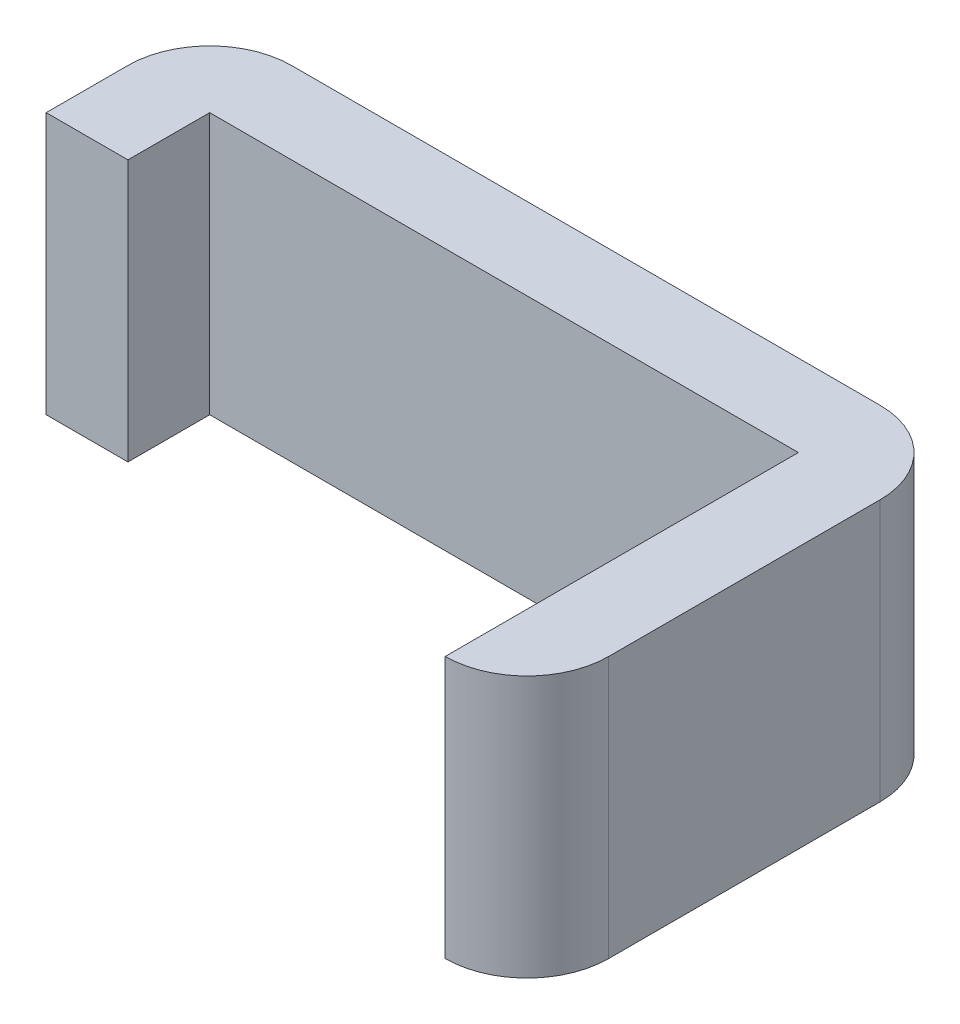
ISO-10303-21;
HEADER;
FILE_DESCRIPTION(('STEP AP214'),'2;1');
FILE_NAME('part.step','',(''),(''),'','','');
FILE_SCHEMA(('AUTOMOTIVE_DESIGN { 1 0 10303 214 1 1 1 1 }'));
ENDSEC;
DATA;
#1=APPLICATION_CONTEXT('core data for automotive mechanical design processes');
#2=APPLICATION_PROTOCOL_DEFINITION('international standard','automotive_design',2000,#1);
#3=PRODUCT_CONTEXT('',#1,'mechanical');
#4=PRODUCT('Part','Part','',(#3));
#5=PRODUCT_RELATED_PRODUCT_CATEGORY('part','',(#4));
#6=PRODUCT_DEFINITION_FORMATION('','',#4);
#7=PRODUCT_DEFINITION_CONTEXT('part definition',#1,'design');
#8=PRODUCT_DEFINITION('design','',#6,#7);
#9=PRODUCT_DEFINITION_SHAPE('','',#8);
#10=(LENGTH_UNIT() NAMED_UNIT(*) SI_UNIT(.MILLI.,.METRE.));
#11=(NAMED_UNIT(*) PLANE_ANGLE_UNIT() SI_UNIT($,.RADIAN.));
#12=(NAMED_UNIT(*) SI_UNIT($,.STERADIAN.) SOLID_ANGLE_UNIT());
#13=UNCERTAINTY_MEASURE_WITH_UNIT(LENGTH_MEASURE(1.E-05),#10,'distance_accuracy_value','');
#14=(GEOMETRIC_REPRESENTATION_CONTEXT(3) GLOBAL_UNCERTAINTY_ASSIGNED_CONTEXT((#13)) GLOBAL_UNIT_ASSIGNED_CONTEXT((#10,
#11,#12)) REPRESENTATION_CONTEXT('',''));
#15=CARTESIAN_POINT('',(0.,0.,0.));
#16=DIRECTION('',(0.,0.,1.));
#17=DIRECTION('',(1.,0.,0.));
#18=AXIS2_PLACEMENT_3D('',#15,#16,#17);
#19=CARTESIAN_POINT('',(-2.1,-0.4,0.25));
#20=DIRECTION('',(0.,0.,-1.));
#21=DIRECTION('',(-1.,0.,0.));
#22=AXIS2_PLACEMENT_3D('',#19,#20,#21);
#23=PLANE('',#22);
#24=DIRECTION('',(0.,1.,0.));
#25=VECTOR('',#24,1.);
#26=CARTESIAN_POINT('',(-0.3,-0.4,0.25));
#27=LINE('',#26,#25);
#28=CARTESIAN_POINT('',(-0.3,-0.4,0.25));
#29=VERTEX_POINT('',#28);
#30=CARTESIAN_POINT('',(-0.3,0.4,0.25));
#31=VERTEX_POINT('',#30);
#32=EDGE_CURVE('E125',#29,#31,#27,.T.);
#33=ORIENTED_EDGE('',*,*,#32,.T.);
#34=DIRECTION('',(1.,0.,0.));
#35=VECTOR('',#34,1.);
#36=CARTESIAN_POINT('',(-0.3,0.4,0.25));
#37=LINE('',#36,#35);
#38=CARTESIAN_POINT('',(-2.1,0.4,0.25));
#39=VERTEX_POINT('',#38);
#40=EDGE_CURVE('E112',#31,#39,#37,.F.);
#41=ORIENTED_EDGE('',*,*,#40,.T.);
#42=DIRECTION('',(0.,1.,0.));
#43=VECTOR('',#42,1.);
#44=CARTESIAN_POINT('',(-2.1,-0.4,0.25));
#45=LINE('',#44,#43);
#46=CARTESIAN_POINT('',(-2.1,-0.4,0.25));
#47=VERTEX_POINT('',#46);
#48=EDGE_CURVE('E108',#39,#47,#45,.F.);
#49=ORIENTED_EDGE('',*,*,#48,.T.);
#50=DIRECTION('',(1.,0.,0.));
#51=VECTOR('',#50,1.);
#52=CARTESIAN_POINT('',(-0.3,-0.4,0.25));
#53=LINE('',#52,#51);
#54=EDGE_CURVE('E126',#29,#47,#53,.F.);
#55=ORIENTED_EDGE('',*,*,#54,.F.);
#56=EDGE_LOOP('',(#33,#41,#49,#55));
#57=FACE_BOUND('',#56,.T.);
#58=ADVANCED_FACE('F17',(#57),#23,.F.);
#59=CARTESIAN_POINT('',(-2.1,-0.4,0.5));
#60=DIRECTION('',(-1.,0.,0.));
#61=DIRECTION('',(0.,0.,1.));
#62=AXIS2_PLACEMENT_3D('',#59,#60,#61);
#63=PLANE('',#62);
#64=ORIENTED_EDGE('',*,*,#48,.F.);
#65=DIRECTION('',(0.,0.,-1.));
#66=VECTOR('',#65,1.);
#67=CARTESIAN_POINT('',(-2.1,0.4,0.25));
#68=LINE('',#67,#66);
#69=CARTESIAN_POINT('',(-2.1,0.4,0.5));
#70=VERTEX_POINT('',#69);
#71=EDGE_CURVE('E120',#39,#70,#68,.F.);
#72=ORIENTED_EDGE('',*,*,#71,.T.);
#73=DIRECTION('',(0.,1.,0.));
#74=VECTOR('',#73,1.);
#75=CARTESIAN_POINT('',(-2.1,-0.4,0.5));
#76=LINE('',#75,#74);
#77=CARTESIAN_POINT('',(-2.1,-0.4,0.5));
#78=VERTEX_POINT('',#77);
#79=EDGE_CURVE('E177',#70,#78,#76,.F.);
#80=ORIENTED_EDGE('',*,*,#79,.T.);
#81=DIRECTION('',(0.,0.,-1.));
#82=VECTOR('',#81,1.);
#83=CARTESIAN_POINT('',(-2.1,-0.4,0.25));
#84=LINE('',#83,#82);
#85=EDGE_CURVE('E168',#47,#78,#84,.F.);
#86=ORIENTED_EDGE('',*,*,#85,.F.);
#87=EDGE_LOOP('',(#64,#72,#80,#86));
#88=FACE_BOUND('',#87,.T.);
#89=ADVANCED_FACE('F227',(#88),#63,.F.);
#90=CARTESIAN_POINT('',(-2.35,-0.4,0.5));
#91=DIRECTION('',(0.,0.,-1.));
#92=DIRECTION('',(-1.,0.,0.));
#93=AXIS2_PLACEMENT_3D('',#90,#91,#92);
#94=PLANE('',#93);
#95=ORIENTED_EDGE('',*,*,#79,.F.);
#96=DIRECTION('',(1.,0.,0.));
#97=VECTOR('',#96,1.);
#98=CARTESIAN_POINT('',(-0.3,0.4,0.5));
#99=LINE('',#98,#97);
#100=CARTESIAN_POINT('',(-2.35,0.4,0.5));
#101=VERTEX_POINT('',#100);
#102=EDGE_CURVE('E145',#70,#101,#99,.F.);
#103=ORIENTED_EDGE('',*,*,#102,.T.);
#104=DIRECTION('',(0.,1.,0.));
#105=VECTOR('',#104,1.);
#106=CARTESIAN_POINT('',(-2.35,-0.4,0.5));
#107=LINE('',#106,#105);
#108=CARTESIAN_POINT('',(-2.35,-0.4,0.5));
#109=VERTEX_POINT('',#108);
#110=EDGE_CURVE('E184',#101,#109,#107,.F.);
#111=ORIENTED_EDGE('',*,*,#110,.T.);
#112=DIRECTION('',(1.,0.,0.));
#113=VECTOR('',#112,1.);
#114=CARTESIAN_POINT('',(-0.3,-0.4,0.5));
#115=LINE('',#114,#113);
#116=EDGE_CURVE('E86',#78,#109,#115,.F.);
#117=ORIENTED_EDGE('',*,*,#116,.F.);
#118=EDGE_LOOP('',(#95,#103,#111,#117));
#119=FACE_BOUND('',#118,.T.);
#120=ADVANCED_FACE('F226',(#119),#94,.F.);
#121=CARTESIAN_POINT('',(-2.35,-0.4,0.25));
#122=DIRECTION('',(1.,0.,0.));
#123=DIRECTION('',(0.,0.,-1.));
#124=AXIS2_PLACEMENT_3D('',#121,#122,#123);
#125=PLANE('',#124);
#126=ORIENTED_EDGE('',*,*,#110,.F.);
#127=DIRECTION('',(0.,0.,-1.));
#128=VECTOR('',#127,1.);
#129=CARTESIAN_POINT('',(-2.35,0.4,0.25));
#130=LINE('',#129,#128);
#131=CARTESIAN_POINT('',(-2.35,0.4,0.25));
#132=VERTEX_POINT('',#131);
#133=EDGE_CURVE('E148',#101,#132,#130,.T.);
#134=ORIENTED_EDGE('',*,*,#133,.T.);
#135=DIRECTION('',(0.,-1.,0.));
#136=VECTOR('',#135,1.);
#137=CARTESIAN_POINT('',(-2.35,-0.4,0.25));
#138=LINE('',#137,#136);
#139=CARTESIAN_POINT('',(-2.35,-0.4,0.25));
#140=VERTEX_POINT('',#139);
#141=EDGE_CURVE('E134',#140,#132,#138,.F.);
#142=ORIENTED_EDGE('',*,*,#141,.F.);
#143=DIRECTION('',(0.,0.,-1.));
#144=VECTOR('',#143,1.);
#145=CARTESIAN_POINT('',(-2.35,-0.4,0.25));
#146=LINE('',#145,#144);
#147=EDGE_CURVE('E80',#109,#140,#146,.T.);
#148=ORIENTED_EDGE('',*,*,#147,.F.);
#149=EDGE_LOOP('',(#126,#134,#142,#148));
#150=FACE_BOUND('',#149,.T.);
#151=ADVANCED_FACE('F224',(#150),#125,.F.);
#152=CARTESIAN_POINT('',(-0.05,-0.4,1.08));
#153=DIRECTION('',(-1.,0.,0.));
#154=DIRECTION('',(0.,0.,1.));
#155=AXIS2_PLACEMENT_3D('',#152,#153,#154);
#156=PLANE('',#155);
#157=DIRECTION('',(0.,-1.,0.));
#158=VECTOR('',#157,1.);
#159=CARTESIAN_POINT('',(-0.05,-0.4,0.25));
#160=LINE('',#159,#158);
#161=CARTESIAN_POINT('',(-0.05,0.4,0.25));
#162=VERTEX_POINT('',#161);
#163=CARTESIAN_POINT('',(-0.05,-0.4,0.25));
#164=VERTEX_POINT('',#163);
#165=EDGE_CURVE('E74',#162,#164,#160,.T.);
#166=ORIENTED_EDGE('',*,*,#165,.F.);
#167=DIRECTION('',(0.,0.,-1.));
#168=VECTOR('',#167,1.);
#169=CARTESIAN_POINT('',(-0.05,0.4,0.25));
#170=LINE('',#169,#168);
#171=CARTESIAN_POINT('',(-0.05,0.4,1.08));
#172=VERTEX_POINT('',#171);
#173=EDGE_CURVE('E139',#162,#172,#170,.F.);
#174=ORIENTED_EDGE('',*,*,#173,.T.);
#175=DIRECTION('',(0.,-1.,0.));
#176=VECTOR('',#175,1.);
#177=CARTESIAN_POINT('',(-0.05,-0.4,1.08));
#178=LINE('',#177,#176);
#179=CARTESIAN_POINT('',(-0.05,-0.4,1.08));
#180=VERTEX_POINT('',#179);
#181=EDGE_CURVE('E190',#180,#172,#178,.F.);
#182=ORIENTED_EDGE('',*,*,#181,.F.);
#183=DIRECTION('',(0.,0.,-1.));
#184=VECTOR('',#183,1.);
#185=CARTESIAN_POINT('',(-0.05,-0.4,0.25));
#186=LINE('',#185,#184);
#187=EDGE_CURVE('E160',#164,#180,#186,.F.);
#188=ORIENTED_EDGE('',*,*,#187,.F.);
#189=EDGE_LOOP('',(#166,#174,#182,#188));
#190=FACE_BOUND('',#189,.T.);
#191=ADVANCED_FACE('F216',(#190),#156,.F.);
#192=CARTESIAN_POINT('',(-0.3,-0.4,1.08));
#193=DIRECTION('',(0.,-1.,0.));
#194=DIRECTION('',(0.,0.,-1.));
#195=AXIS2_PLACEMENT_3D('',#192,#193,#194);
#196=CYLINDRICAL_SURFACE('',#195,0.25);
#197=CARTESIAN_POINT('',(-0.3,0.4,1.08));
#198=DIRECTION('',(0.,-1.,0.));
#199=DIRECTION('',(0.,0.,-1.));
#200=AXIS2_PLACEMENT_3D('',#197,#198,#199);
#201=CIRCLE('',#200,0.25);
#202=CARTESIAN_POINT('',(-0.3,0.4,1.33));
#203=VERTEX_POINT('',#202);
#204=EDGE_CURVE('E135',#172,#203,#201,.T.);
#205=ORIENTED_EDGE('',*,*,#204,.T.);
#206=DIRECTION('',(0.,1.,0.));
#207=VECTOR('',#206,1.);
#208=CARTESIAN_POINT('',(-0.3,-0.4,1.33));
#209=LINE('',#208,#207);
#210=CARTESIAN_POINT('',(-0.3,-0.4,1.33));
#211=VERTEX_POINT('',#210);
#212=EDGE_CURVE('E129',#203,#211,#209,.F.);
#213=ORIENTED_EDGE('',*,*,#212,.T.);
#214=CARTESIAN_POINT('',(-0.3,-0.4,1.08));
#215=DIRECTION('',(0.,-1.,0.));
#216=DIRECTION('',(0.,0.,-1.));
#217=AXIS2_PLACEMENT_3D('',#214,#215,#216);
#218=CIRCLE('',#217,0.25);
#219=EDGE_CURVE('E156',#180,#211,#218,.T.);
#220=ORIENTED_EDGE('',*,*,#219,.F.);
#221=ORIENTED_EDGE('',*,*,#181,.T.);
#222=EDGE_LOOP('',(#205,#213,#220,#221));
#223=FACE_BOUND('',#222,.T.);
#224=ADVANCED_FACE('F218',(#223),#196,.T.);
#225=CARTESIAN_POINT('',(-0.3,-0.4,0.25));
#226=DIRECTION('',(1.,0.,0.));
#227=DIRECTION('',(0.,0.,-1.));
#228=AXIS2_PLACEMENT_3D('',#225,#226,#227);
#229=PLANE('',#228);
#230=DIRECTION('',(0.,0.,-1.));
#231=VECTOR('',#230,1.);
#232=CARTESIAN_POINT('',(-0.3,-0.4,0.25));
#233=LINE('',#232,#231);
#234=EDGE_CURVE('E159',#211,#29,#233,.T.);
#235=ORIENTED_EDGE('',*,*,#234,.F.);
#236=ORIENTED_EDGE('',*,*,#212,.F.);
#237=DIRECTION('',(0.,0.,-1.));
#238=VECTOR('',#237,1.);
#239=CARTESIAN_POINT('',(-0.3,0.4,0.25));
#240=LINE('',#239,#238);
#241=EDGE_CURVE('E117',#203,#31,#240,.T.);
#242=ORIENTED_EDGE('',*,*,#241,.T.);
#243=ORIENTED_EDGE('',*,*,#32,.F.);
#244=EDGE_LOOP('',(#235,#236,#242,#243));
#245=FACE_BOUND('',#244,.T.);
#246=ADVANCED_FACE('F131',(#245),#229,.F.);
#247=CARTESIAN_POINT('',(-0.3,-0.4,0.25));
#248=DIRECTION('',(0.,-1.,0.));
#249=DIRECTION('',(0.,0.,-1.));
#250=AXIS2_PLACEMENT_3D('',#247,#248,#249);
#251=CYLINDRICAL_SURFACE('',#250,0.25);
#252=CARTESIAN_POINT('',(-0.3,0.4,0.25));
#253=DIRECTION('',(0.,-1.,0.));
#254=DIRECTION('',(0.,0.,-1.));
#255=AXIS2_PLACEMENT_3D('',#252,#253,#254);
#256=CIRCLE('',#255,0.25);
#257=CARTESIAN_POINT('',(-0.3,0.4,0.));
#258=VERTEX_POINT('',#257);
#259=EDGE_CURVE('E20',#258,#162,#256,.T.);
#260=ORIENTED_EDGE('',*,*,#259,.T.);
#261=ORIENTED_EDGE('',*,*,#165,.T.);
#262=CARTESIAN_POINT('',(-0.3,-0.4,0.25));
#263=DIRECTION('',(0.,-1.,0.));
#264=DIRECTION('',(0.,0.,-1.));
#265=AXIS2_PLACEMENT_3D('',#262,#263,#264);
#266=CIRCLE('',#265,0.25);
#267=CARTESIAN_POINT('',(-0.3,-0.4,0.));
#268=VERTEX_POINT('',#267);
#269=EDGE_CURVE('E161',#268,#164,#266,.T.);
#270=ORIENTED_EDGE('',*,*,#269,.F.);
#271=DIRECTION('',(0.,1.,0.));
#272=VECTOR('',#271,1.);
#273=CARTESIAN_POINT('',(-0.3,-0.4,0.));
#274=LINE('',#273,#272);
#275=EDGE_CURVE('E64',#268,#258,#274,.T.);
#276=ORIENTED_EDGE('',*,*,#275,.T.);
#277=EDGE_LOOP('',(#260,#261,#270,#276));
#278=FACE_BOUND('',#277,.T.);
#279=ADVANCED_FACE('F219',(#278),#251,.T.);
#280=CARTESIAN_POINT('',(-0.3,0.4,0.25));
#281=DIRECTION('',(0.,-1.,0.));
#282=DIRECTION('',(0.,0.,-1.));
#283=AXIS2_PLACEMENT_3D('',#280,#281,#282);
#284=PLANE('',#283);
#285=ORIENTED_EDGE('',*,*,#241,.F.);
#286=ORIENTED_EDGE('',*,*,#204,.F.);
#287=ORIENTED_EDGE('',*,*,#173,.F.);
#288=ORIENTED_EDGE('',*,*,#259,.F.);
#289=DIRECTION('',(1.,0.,0.));
#290=VECTOR('',#289,1.);
#291=CARTESIAN_POINT('',(-0.3,0.4,0.));
#292=LINE('',#291,#290);
#293=CARTESIAN_POINT('',(-2.1,0.4,0.));
#294=VERTEX_POINT('',#293);
#295=EDGE_CURVE('E204',#258,#294,#292,.F.);
#296=ORIENTED_EDGE('',*,*,#295,.T.);
#297=CARTESIAN_POINT('',(-2.1,0.4,0.25));
#298=DIRECTION('',(0.,-1.,0.));
#299=DIRECTION('',(0.,0.,-1.));
#300=AXIS2_PLACEMENT_3D('',#297,#298,#299);
#301=CIRCLE('',#300,0.25);
#302=EDGE_CURVE('E137',#132,#294,#301,.T.);
#303=ORIENTED_EDGE('',*,*,#302,.F.);
#304=ORIENTED_EDGE('',*,*,#133,.F.);
#305=ORIENTED_EDGE('',*,*,#102,.F.);
#306=ORIENTED_EDGE('',*,*,#71,.F.);
#307=ORIENTED_EDGE('',*,*,#40,.F.);
#308=EDGE_LOOP('',(#285,#286,#287,#288,#296,#303,#304,#305,#306,#307));
#309=FACE_BOUND('',#308,.T.);
#310=ADVANCED_FACE('F114',(#309),#284,.F.);
#311=CARTESIAN_POINT('',(-2.1,-0.4,0.25));
#312=DIRECTION('',(0.,-1.,0.));
#313=DIRECTION('',(0.,0.,-1.));
#314=AXIS2_PLACEMENT_3D('',#311,#312,#313);
#315=CYLINDRICAL_SURFACE('',#314,0.25);
#316=ORIENTED_EDGE('',*,*,#302,.T.);
#317=DIRECTION('',(0.,1.,0.));
#318=VECTOR('',#317,1.);
#319=CARTESIAN_POINT('',(-2.1,-0.4,0.));
#320=LINE('',#319,#318);
#321=CARTESIAN_POINT('',(-2.1,-0.4,0.));
#322=VERTEX_POINT('',#321);
#323=EDGE_CURVE('E26',#294,#322,#320,.F.);
#324=ORIENTED_EDGE('',*,*,#323,.T.);
#325=CARTESIAN_POINT('',(-2.1,-0.4,0.25));
#326=DIRECTION('',(0.,-1.,0.));
#327=DIRECTION('',(0.,0.,-1.));
#328=AXIS2_PLACEMENT_3D('',#325,#326,#327);
#329=CIRCLE('',#328,0.25);
#330=EDGE_CURVE('E34',#140,#322,#329,.T.);
#331=ORIENTED_EDGE('',*,*,#330,.F.);
#332=ORIENTED_EDGE('',*,*,#141,.T.);
#333=EDGE_LOOP('',(#316,#324,#331,#332));
#334=FACE_BOUND('',#333,.T.);
#335=ADVANCED_FACE('F221',(#334),#315,.T.);
#336=CARTESIAN_POINT('',(-0.3,-0.4,0.25));
#337=DIRECTION('',(0.,-1.,0.));
#338=DIRECTION('',(0.,0.,-1.));
#339=AXIS2_PLACEMENT_3D('',#336,#337,#338);
#340=PLANE('',#339);
#341=ORIENTED_EDGE('',*,*,#219,.T.);
#342=ORIENTED_EDGE('',*,*,#234,.T.);
#343=ORIENTED_EDGE('',*,*,#54,.T.);
#344=ORIENTED_EDGE('',*,*,#85,.T.);
#345=ORIENTED_EDGE('',*,*,#116,.T.);
#346=ORIENTED_EDGE('',*,*,#147,.T.);
#347=ORIENTED_EDGE('',*,*,#330,.T.);
#348=DIRECTION('',(1.,0.,0.));
#349=VECTOR('',#348,1.);
#350=CARTESIAN_POINT('',(-0.3,-0.4,0.));
#351=LINE('',#350,#349);
#352=EDGE_CURVE('E11',#322,#268,#351,.T.);
#353=ORIENTED_EDGE('',*,*,#352,.T.);
#354=ORIENTED_EDGE('',*,*,#269,.T.);
#355=ORIENTED_EDGE('',*,*,#187,.T.);
#356=EDGE_LOOP('',(#341,#342,#343,#344,#345,#346,#347,#353,#354,#355));
#357=FACE_BOUND('',#356,.T.);
#358=ADVANCED_FACE('F213',(#357),#340,.T.);
#359=CARTESIAN_POINT('',(-0.3,-0.4,0.));
#360=DIRECTION('',(0.,0.,1.));
#361=DIRECTION('',(1.,0.,0.));
#362=AXIS2_PLACEMENT_3D('',#359,#360,#361);
#363=PLANE('',#362);
#364=ORIENTED_EDGE('',*,*,#323,.F.);
#365=ORIENTED_EDGE('',*,*,#295,.F.);
#366=ORIENTED_EDGE('',*,*,#275,.F.);
#367=ORIENTED_EDGE('',*,*,#352,.F.);
#368=EDGE_LOOP('',(#364,#365,#366,#367));
#369=FACE_BOUND('',#368,.T.);
#370=ADVANCED_FACE('F220',(#369),#363,.F.);
#371=CLOSED_SHELL('',(#58,#89,#120,#151,#191,#224,#246,#279,#310,#335,#358,#370));
#372=MANIFOLD_SOLID_BREP('B1',#371);
#373=ADVANCED_BREP_SHAPE_REPRESENTATION('',(#18,#372),#14);
#374=SHAPE_DEFINITION_REPRESENTATION(#9,#373);
ENDSEC;
END-ISO-10303-21;
